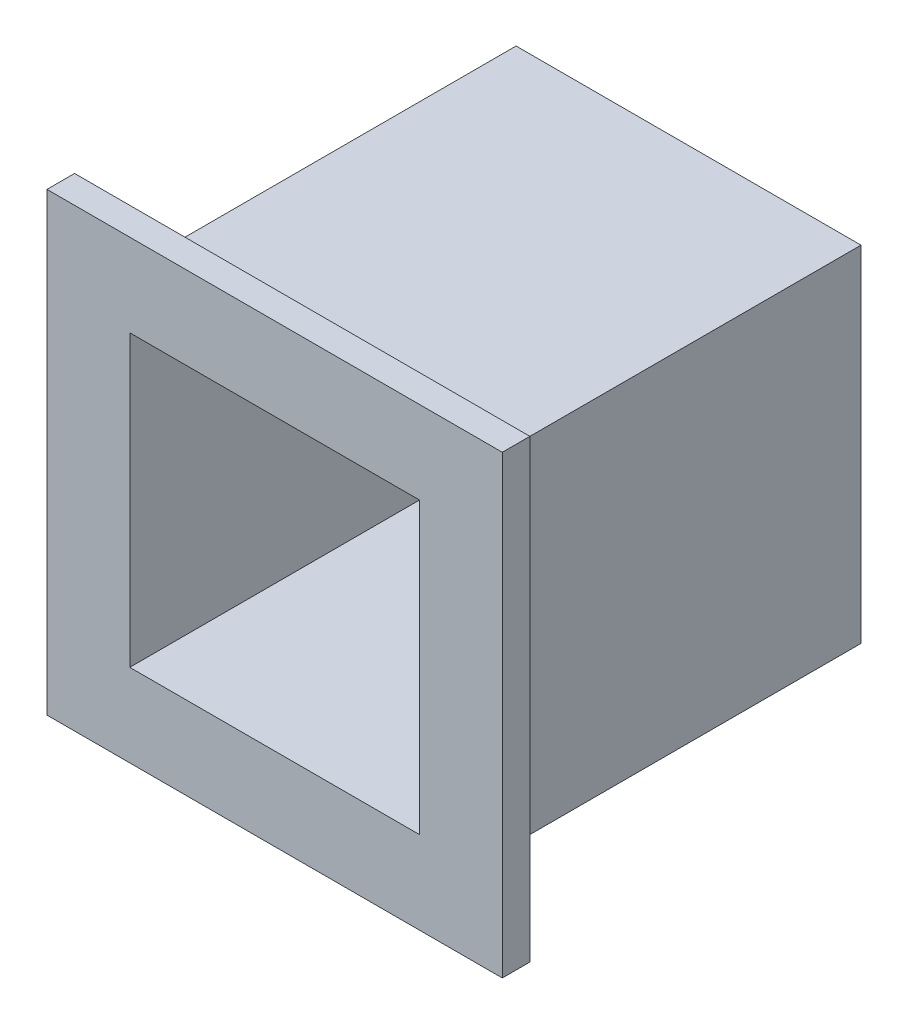
ISO-10303-21;
HEADER;
FILE_DESCRIPTION(('STEP AP214'),'2;1');
FILE_NAME('part.step','',(''),(''),'','','');
FILE_SCHEMA(('AUTOMOTIVE_DESIGN { 1 0 10303 214 1 1 1 1 }'));
ENDSEC;
DATA;
#1=APPLICATION_CONTEXT('core data for automotive mechanical design processes');
#2=APPLICATION_PROTOCOL_DEFINITION('international standard','automotive_design',2000,#1);
#3=PRODUCT_CONTEXT('',#1,'mechanical');
#4=PRODUCT('Part','Part','',(#3));
#5=PRODUCT_RELATED_PRODUCT_CATEGORY('part','',(#4));
#6=PRODUCT_DEFINITION_FORMATION('','',#4);
#7=PRODUCT_DEFINITION_CONTEXT('part definition',#1,'design');
#8=PRODUCT_DEFINITION('design','',#6,#7);
#9=PRODUCT_DEFINITION_SHAPE('','',#8);
#10=(LENGTH_UNIT() NAMED_UNIT(*) SI_UNIT(.MILLI.,.METRE.));
#11=(NAMED_UNIT(*) PLANE_ANGLE_UNIT() SI_UNIT($,.RADIAN.));
#12=(NAMED_UNIT(*) SI_UNIT($,.STERADIAN.) SOLID_ANGLE_UNIT());
#13=UNCERTAINTY_MEASURE_WITH_UNIT(LENGTH_MEASURE(1.E-05),#10,'distance_accuracy_value','');
#14=(GEOMETRIC_REPRESENTATION_CONTEXT(3) GLOBAL_UNCERTAINTY_ASSIGNED_CONTEXT((#13)) GLOBAL_UNIT_ASSIGNED_CONTEXT((#10,
#11,#12)) REPRESENTATION_CONTEXT('',''));
#15=CARTESIAN_POINT('',(0.,0.,0.));
#16=DIRECTION('',(0.,0.,1.));
#17=DIRECTION('',(1.,0.,0.));
#18=AXIS2_PLACEMENT_3D('',#15,#16,#17);
#19=CARTESIAN_POINT('',(0.,0.,15.));
#20=DIRECTION('',(0.,0.,1.));
#21=DIRECTION('',(1.,0.,0.));
#22=AXIS2_PLACEMENT_3D('',#19,#20,#21);
#23=PLANE('',#22);
#24=DIRECTION('',(0.,-1.,0.));
#25=VECTOR('',#24,1.);
#26=CARTESIAN_POINT('',(-5.25,-6.25,15.));
#27=LINE('',#26,#25);
#28=CARTESIAN_POINT('',(-5.25,5.25,15.));
#29=VERTEX_POINT('',#28);
#30=CARTESIAN_POINT('',(-5.25,-5.25,15.));
#31=VERTEX_POINT('',#30);
#32=EDGE_CURVE('E203',#29,#31,#27,.T.);
#33=ORIENTED_EDGE('',*,*,#32,.F.);
#34=DIRECTION('',(-1.,0.,0.));
#35=VECTOR('',#34,1.);
#36=CARTESIAN_POINT('',(6.25,5.25,15.));
#37=LINE('',#36,#35);
#38=CARTESIAN_POINT('',(5.25,5.25,15.));
#39=VERTEX_POINT('',#38);
#40=EDGE_CURVE('E193',#39,#29,#37,.T.);
#41=ORIENTED_EDGE('',*,*,#40,.F.);
#42=DIRECTION('',(0.,1.,0.));
#43=VECTOR('',#42,1.);
#44=CARTESIAN_POINT('',(5.25,-6.25,15.));
#45=LINE('',#44,#43);
#46=CARTESIAN_POINT('',(5.25,-5.25,15.));
#47=VERTEX_POINT('',#46);
#48=EDGE_CURVE('E207',#47,#39,#45,.T.);
#49=ORIENTED_EDGE('',*,*,#48,.F.);
#50=DIRECTION('',(1.,0.,0.));
#51=VECTOR('',#50,1.);
#52=CARTESIAN_POINT('',(6.25,-5.25,15.));
#53=LINE('',#52,#51);
#54=EDGE_CURVE('E205',#31,#47,#53,.T.);
#55=ORIENTED_EDGE('',*,*,#54,.F.);
#56=EDGE_LOOP('',(#33,#41,#49,#55));
#57=FACE_BOUND('',#56,.T.);
#58=DIRECTION('',(0.,1.,0.));
#59=VECTOR('',#58,1.);
#60=CARTESIAN_POINT('',(8.25,-8.25,15.));
#61=LINE('',#60,#59);
#62=CARTESIAN_POINT('',(8.25,-8.25,15.));
#63=VERTEX_POINT('',#62);
#64=CARTESIAN_POINT('',(8.25,8.25,15.));
#65=VERTEX_POINT('',#64);
#66=EDGE_CURVE('E148',#63,#65,#61,.T.);
#67=ORIENTED_EDGE('',*,*,#66,.T.);
#68=DIRECTION('',(-1.,0.,0.));
#69=VECTOR('',#68,1.);
#70=CARTESIAN_POINT('',(8.25,8.25,15.));
#71=LINE('',#70,#69);
#72=CARTESIAN_POINT('',(-8.25,8.25,15.));
#73=VERTEX_POINT('',#72);
#74=EDGE_CURVE('E165',#65,#73,#71,.T.);
#75=ORIENTED_EDGE('',*,*,#74,.T.);
#76=DIRECTION('',(0.,-1.,0.));
#77=VECTOR('',#76,1.);
#78=CARTESIAN_POINT('',(-8.25,8.25,15.));
#79=LINE('',#78,#77);
#80=CARTESIAN_POINT('',(-8.25,-8.25,15.));
#81=VERTEX_POINT('',#80);
#82=EDGE_CURVE('E168',#73,#81,#79,.T.);
#83=ORIENTED_EDGE('',*,*,#82,.T.);
#84=DIRECTION('',(1.,0.,0.));
#85=VECTOR('',#84,1.);
#86=CARTESIAN_POINT('',(-8.25,-8.25,15.));
#87=LINE('',#86,#85);
#88=EDGE_CURVE('E153',#81,#63,#87,.T.);
#89=ORIENTED_EDGE('',*,*,#88,.T.);
#90=EDGE_LOOP('',(#67,#75,#83,#89));
#91=FACE_BOUND('',#90,.T.);
#92=ADVANCED_FACE('F38',(#57,#91),#23,.T.);
#93=CARTESIAN_POINT('',(-5.25,-6.25,15.));
#94=DIRECTION('',(1.,0.,0.));
#95=DIRECTION('',(0.,0.,-1.));
#96=AXIS2_PLACEMENT_3D('',#93,#94,#95);
#97=PLANE('',#96);
#98=DIRECTION('',(0.,-1.,0.));
#99=VECTOR('',#98,1.);
#100=CARTESIAN_POINT('',(-5.25,-6.25,1.));
#101=LINE('',#100,#99);
#102=CARTESIAN_POINT('',(-5.25,5.25,1.));
#103=VERTEX_POINT('',#102);
#104=CARTESIAN_POINT('',(-5.25,-5.25,1.));
#105=VERTEX_POINT('',#104);
#106=EDGE_CURVE('E175',#103,#105,#101,.T.);
#107=ORIENTED_EDGE('',*,*,#106,.F.);
#108=DIRECTION('',(0.,0.,-1.));
#109=VECTOR('',#108,1.);
#110=CARTESIAN_POINT('',(-5.25,5.25,15.));
#111=LINE('',#110,#109);
#112=EDGE_CURVE('E189',#29,#103,#111,.T.);
#113=ORIENTED_EDGE('',*,*,#112,.F.);
#114=ORIENTED_EDGE('',*,*,#32,.T.);
#115=DIRECTION('',(0.,0.,-1.));
#116=VECTOR('',#115,1.);
#117=CARTESIAN_POINT('',(-5.25,-5.25,15.));
#118=LINE('',#117,#116);
#119=EDGE_CURVE('E184',#31,#105,#118,.T.);
#120=ORIENTED_EDGE('',*,*,#119,.T.);
#121=EDGE_LOOP('',(#107,#113,#114,#120));
#122=FACE_BOUND('',#121,.T.);
#123=ADVANCED_FACE('F236',(#122),#97,.T.);
#124=CARTESIAN_POINT('',(6.25,-5.25,15.));
#125=DIRECTION('',(0.,1.,0.));
#126=DIRECTION('',(-1.,0.,0.));
#127=AXIS2_PLACEMENT_3D('',#124,#125,#126);
#128=PLANE('',#127);
#129=DIRECTION('',(1.,0.,0.));
#130=VECTOR('',#129,1.);
#131=CARTESIAN_POINT('',(6.25,-5.25,1.));
#132=LINE('',#131,#130);
#133=CARTESIAN_POINT('',(5.25,-5.25,1.));
#134=VERTEX_POINT('',#133);
#135=EDGE_CURVE('E183',#105,#134,#132,.T.);
#136=ORIENTED_EDGE('',*,*,#135,.F.);
#137=ORIENTED_EDGE('',*,*,#119,.F.);
#138=ORIENTED_EDGE('',*,*,#54,.T.);
#139=DIRECTION('',(0.,0.,-1.));
#140=VECTOR('',#139,1.);
#141=CARTESIAN_POINT('',(5.25,-5.25,15.));
#142=LINE('',#141,#140);
#143=EDGE_CURVE('E188',#47,#134,#142,.T.);
#144=ORIENTED_EDGE('',*,*,#143,.T.);
#145=EDGE_LOOP('',(#136,#137,#138,#144));
#146=FACE_BOUND('',#145,.T.);
#147=ADVANCED_FACE('F241',(#146),#128,.T.);
#148=CARTESIAN_POINT('',(5.25,-6.25,15.));
#149=DIRECTION('',(-1.,0.,0.));
#150=DIRECTION('',(0.,0.,1.));
#151=AXIS2_PLACEMENT_3D('',#148,#149,#150);
#152=PLANE('',#151);
#153=DIRECTION('',(0.,1.,0.));
#154=VECTOR('',#153,1.);
#155=CARTESIAN_POINT('',(5.25,-6.25,1.));
#156=LINE('',#155,#154);
#157=CARTESIAN_POINT('',(5.25,5.25,1.));
#158=VERTEX_POINT('',#157);
#159=EDGE_CURVE('E195',#134,#158,#156,.T.);
#160=ORIENTED_EDGE('',*,*,#159,.F.);
#161=ORIENTED_EDGE('',*,*,#143,.F.);
#162=ORIENTED_EDGE('',*,*,#48,.T.);
#163=DIRECTION('',(0.,0.,-1.));
#164=VECTOR('',#163,1.);
#165=CARTESIAN_POINT('',(5.25,5.25,15.));
#166=LINE('',#165,#164);
#167=EDGE_CURVE('E192',#39,#158,#166,.T.);
#168=ORIENTED_EDGE('',*,*,#167,.T.);
#169=EDGE_LOOP('',(#160,#161,#162,#168));
#170=FACE_BOUND('',#169,.T.);
#171=ADVANCED_FACE('F255',(#170),#152,.T.);
#172=CARTESIAN_POINT('',(6.25,5.25,15.));
#173=DIRECTION('',(0.,-1.,0.));
#174=DIRECTION('',(1.,0.,0.));
#175=AXIS2_PLACEMENT_3D('',#172,#173,#174);
#176=PLANE('',#175);
#177=DIRECTION('',(-1.,0.,0.));
#178=VECTOR('',#177,1.);
#179=CARTESIAN_POINT('',(6.25,5.25,1.));
#180=LINE('',#179,#178);
#181=EDGE_CURVE('E199',#158,#103,#180,.T.);
#182=ORIENTED_EDGE('',*,*,#181,.F.);
#183=ORIENTED_EDGE('',*,*,#167,.F.);
#184=ORIENTED_EDGE('',*,*,#40,.T.);
#185=ORIENTED_EDGE('',*,*,#112,.T.);
#186=EDGE_LOOP('',(#182,#183,#184,#185));
#187=FACE_BOUND('',#186,.T.);
#188=ADVANCED_FACE('F251',(#187),#176,.T.);
#189=CARTESIAN_POINT('',(0.,0.,1.));
#190=DIRECTION('',(0.,0.,1.));
#191=DIRECTION('',(1.,0.,0.));
#192=AXIS2_PLACEMENT_3D('',#189,#190,#191);
#193=PLANE('',#192);
#194=ORIENTED_EDGE('',*,*,#106,.T.);
#195=ORIENTED_EDGE('',*,*,#135,.T.);
#196=ORIENTED_EDGE('',*,*,#159,.T.);
#197=ORIENTED_EDGE('',*,*,#181,.T.);
#198=EDGE_LOOP('',(#194,#195,#196,#197));
#199=FACE_BOUND('',#198,.T.);
#200=ADVANCED_FACE('F247',(#199),#193,.T.);
#201=CARTESIAN_POINT('',(8.25,-8.25,14.));
#202=DIRECTION('',(1.,0.,0.));
#203=DIRECTION('',(0.,0.,-1.));
#204=AXIS2_PLACEMENT_3D('',#201,#202,#203);
#205=PLANE('',#204);
#206=ORIENTED_EDGE('',*,*,#66,.F.);
#207=DIRECTION('',(0.,0.,1.));
#208=VECTOR('',#207,1.);
#209=CARTESIAN_POINT('',(8.25,-8.25,14.));
#210=LINE('',#209,#208);
#211=CARTESIAN_POINT('',(8.25,-8.25,14.));
#212=VERTEX_POINT('',#211);
#213=EDGE_CURVE('E173',#212,#63,#210,.T.);
#214=ORIENTED_EDGE('',*,*,#213,.F.);
#215=DIRECTION('',(0.,1.,0.));
#216=VECTOR('',#215,1.);
#217=CARTESIAN_POINT('',(8.25,-8.25,14.));
#218=LINE('',#217,#216);
#219=CARTESIAN_POINT('',(8.25,8.25,14.));
#220=VERTEX_POINT('',#219);
#221=EDGE_CURVE('E149',#212,#220,#218,.T.);
#222=ORIENTED_EDGE('',*,*,#221,.T.);
#223=DIRECTION('',(0.,0.,1.));
#224=VECTOR('',#223,1.);
#225=CARTESIAN_POINT('',(8.25,8.25,14.));
#226=LINE('',#225,#224);
#227=EDGE_CURVE('E162',#220,#65,#226,.T.);
#228=ORIENTED_EDGE('',*,*,#227,.T.);
#229=EDGE_LOOP('',(#206,#214,#222,#228));
#230=FACE_BOUND('',#229,.T.);
#231=ADVANCED_FACE('F250',(#230),#205,.T.);
#232=CARTESIAN_POINT('',(-8.25,-8.25,14.));
#233=DIRECTION('',(0.,-1.,0.));
#234=DIRECTION('',(1.,0.,0.));
#235=AXIS2_PLACEMENT_3D('',#232,#233,#234);
#236=PLANE('',#235);
#237=ORIENTED_EDGE('',*,*,#88,.F.);
#238=DIRECTION('',(0.,0.,1.));
#239=VECTOR('',#238,1.);
#240=CARTESIAN_POINT('',(-8.25,-8.25,14.));
#241=LINE('',#240,#239);
#242=CARTESIAN_POINT('',(-8.25,-8.25,14.));
#243=VERTEX_POINT('',#242);
#244=EDGE_CURVE('E176',#243,#81,#241,.T.);
#245=ORIENTED_EDGE('',*,*,#244,.F.);
#246=DIRECTION('',(1.,0.,0.));
#247=VECTOR('',#246,1.);
#248=CARTESIAN_POINT('',(-8.25,-8.25,14.));
#249=LINE('',#248,#247);
#250=EDGE_CURVE('E159',#243,#212,#249,.T.);
#251=ORIENTED_EDGE('',*,*,#250,.T.);
#252=ORIENTED_EDGE('',*,*,#213,.T.);
#253=EDGE_LOOP('',(#237,#245,#251,#252));
#254=FACE_BOUND('',#253,.T.);
#255=ADVANCED_FACE('F265',(#254),#236,.T.);
#256=CARTESIAN_POINT('',(-8.25,8.25,14.));
#257=DIRECTION('',(-1.,0.,0.));
#258=DIRECTION('',(0.,-1.,0.));
#259=AXIS2_PLACEMENT_3D('',#256,#257,#258);
#260=PLANE('',#259);
#261=ORIENTED_EDGE('',*,*,#82,.F.);
#262=DIRECTION('',(0.,0.,1.));
#263=VECTOR('',#262,1.);
#264=CARTESIAN_POINT('',(-8.25,8.25,14.));
#265=LINE('',#264,#263);
#266=CARTESIAN_POINT('',(-8.25,8.25,14.));
#267=VERTEX_POINT('',#266);
#268=EDGE_CURVE('E178',#267,#73,#265,.T.);
#269=ORIENTED_EDGE('',*,*,#268,.F.);
#270=DIRECTION('',(0.,-1.,0.));
#271=VECTOR('',#270,1.);
#272=CARTESIAN_POINT('',(-8.25,8.25,14.));
#273=LINE('',#272,#271);
#274=EDGE_CURVE('E156',#267,#243,#273,.T.);
#275=ORIENTED_EDGE('',*,*,#274,.T.);
#276=ORIENTED_EDGE('',*,*,#244,.T.);
#277=EDGE_LOOP('',(#261,#269,#275,#276));
#278=FACE_BOUND('',#277,.T.);
#279=ADVANCED_FACE('F269',(#278),#260,.T.);
#280=CARTESIAN_POINT('',(8.25,8.25,14.));
#281=DIRECTION('',(0.,1.,0.));
#282=DIRECTION('',(-1.,0.,0.));
#283=AXIS2_PLACEMENT_3D('',#280,#281,#282);
#284=PLANE('',#283);
#285=ORIENTED_EDGE('',*,*,#74,.F.);
#286=ORIENTED_EDGE('',*,*,#227,.F.);
#287=DIRECTION('',(-1.,0.,0.));
#288=VECTOR('',#287,1.);
#289=CARTESIAN_POINT('',(8.25,8.25,14.));
#290=LINE('',#289,#288);
#291=EDGE_CURVE('E152',#220,#267,#290,.T.);
#292=ORIENTED_EDGE('',*,*,#291,.T.);
#293=ORIENTED_EDGE('',*,*,#268,.T.);
#294=EDGE_LOOP('',(#285,#286,#292,#293));
#295=FACE_BOUND('',#294,.T.);
#296=ADVANCED_FACE('F232',(#295),#284,.T.);
#297=CARTESIAN_POINT('',(0.,0.,14.));
#298=DIRECTION('',(0.,0.,1.));
#299=DIRECTION('',(1.,0.,0.));
#300=AXIS2_PLACEMENT_3D('',#297,#298,#299);
#301=PLANE('',#300);
#302=DIRECTION('',(0.,1.,0.));
#303=VECTOR('',#302,1.);
#304=CARTESIAN_POINT('',(6.25,-6.25,14.));
#305=LINE('',#304,#303);
#306=CARTESIAN_POINT('',(6.25,-6.25,14.));
#307=VERTEX_POINT('',#306);
#308=CARTESIAN_POINT('',(6.25,6.25,14.));
#309=VERTEX_POINT('',#308);
#310=EDGE_CURVE('E60',#307,#309,#305,.T.);
#311=ORIENTED_EDGE('',*,*,#310,.T.);
#312=DIRECTION('',(-1.,0.,0.));
#313=VECTOR('',#312,1.);
#314=CARTESIAN_POINT('',(6.25,6.25,14.));
#315=LINE('',#314,#313);
#316=CARTESIAN_POINT('',(-6.25,6.25,14.));
#317=VERTEX_POINT('',#316);
#318=EDGE_CURVE('E130',#309,#317,#315,.T.);
#319=ORIENTED_EDGE('',*,*,#318,.T.);
#320=DIRECTION('',(0.,-1.,0.));
#321=VECTOR('',#320,1.);
#322=CARTESIAN_POINT('',(-6.25,6.25,14.));
#323=LINE('',#322,#321);
#324=CARTESIAN_POINT('',(-6.25,-6.25,14.));
#325=VERTEX_POINT('',#324);
#326=EDGE_CURVE('E139',#317,#325,#323,.T.);
#327=ORIENTED_EDGE('',*,*,#326,.T.);
#328=DIRECTION('',(1.,0.,0.));
#329=VECTOR('',#328,1.);
#330=CARTESIAN_POINT('',(-6.25,-6.25,14.));
#331=LINE('',#330,#329);
#332=EDGE_CURVE('E52',#325,#307,#331,.T.);
#333=ORIENTED_EDGE('',*,*,#332,.T.);
#334=EDGE_LOOP('',(#311,#319,#327,#333));
#335=FACE_BOUND('',#334,.T.);
#336=ORIENTED_EDGE('',*,*,#221,.F.);
#337=ORIENTED_EDGE('',*,*,#250,.F.);
#338=ORIENTED_EDGE('',*,*,#274,.F.);
#339=ORIENTED_EDGE('',*,*,#291,.F.);
#340=EDGE_LOOP('',(#336,#337,#338,#339));
#341=FACE_BOUND('',#340,.T.);
#342=ADVANCED_FACE('F142',(#335,#341),#301,.F.);
#343=CARTESIAN_POINT('',(0.,0.,0.));
#344=DIRECTION('',(0.,0.,1.));
#345=DIRECTION('',(1.,0.,0.));
#346=AXIS2_PLACEMENT_3D('',#343,#344,#345);
#347=PLANE('',#346);
#348=DIRECTION('',(0.,-1.,0.));
#349=VECTOR('',#348,1.);
#350=CARTESIAN_POINT('',(-6.25,-6.25,0.));
#351=LINE('',#350,#349);
#352=CARTESIAN_POINT('',(-6.25,6.25,0.));
#353=VERTEX_POINT('',#352);
#354=CARTESIAN_POINT('',(-6.25,-6.25,0.));
#355=VERTEX_POINT('',#354);
#356=EDGE_CURVE('E187',#353,#355,#351,.T.);
#357=ORIENTED_EDGE('',*,*,#356,.F.);
#358=DIRECTION('',(-1.,0.,0.));
#359=VECTOR('',#358,1.);
#360=CARTESIAN_POINT('',(6.25,6.25,0.));
#361=LINE('',#360,#359);
#362=CARTESIAN_POINT('',(6.25,6.25,0.));
#363=VERTEX_POINT('',#362);
#364=EDGE_CURVE('E132',#363,#353,#361,.T.);
#365=ORIENTED_EDGE('',*,*,#364,.F.);
#366=DIRECTION('',(0.,1.,0.));
#367=VECTOR('',#366,1.);
#368=CARTESIAN_POINT('',(6.25,-6.25,0.));
#369=LINE('',#368,#367);
#370=CARTESIAN_POINT('',(6.25,-6.25,0.));
#371=VERTEX_POINT('',#370);
#372=EDGE_CURVE('E215',#371,#363,#369,.T.);
#373=ORIENTED_EDGE('',*,*,#372,.F.);
#374=DIRECTION('',(1.,0.,0.));
#375=VECTOR('',#374,1.);
#376=CARTESIAN_POINT('',(6.25,-6.25,0.));
#377=LINE('',#376,#375);
#378=EDGE_CURVE('E212',#355,#371,#377,.T.);
#379=ORIENTED_EDGE('',*,*,#378,.F.);
#380=EDGE_LOOP('',(#357,#365,#373,#379));
#381=FACE_BOUND('',#380,.T.);
#382=ADVANCED_FACE('F224',(#381),#347,.F.);
#383=CARTESIAN_POINT('',(6.25,6.25,15.));
#384=DIRECTION('',(0.,-1.,0.));
#385=DIRECTION('',(1.,0.,0.));
#386=AXIS2_PLACEMENT_3D('',#383,#384,#385);
#387=PLANE('',#386);
#388=ORIENTED_EDGE('',*,*,#318,.F.);
#389=DIRECTION('',(0.,0.,-1.));
#390=VECTOR('',#389,1.);
#391=CARTESIAN_POINT('',(6.25,6.25,15.));
#392=LINE('',#391,#390);
#393=EDGE_CURVE('E136',#309,#363,#392,.T.);
#394=ORIENTED_EDGE('',*,*,#393,.T.);
#395=ORIENTED_EDGE('',*,*,#364,.T.);
#396=DIRECTION('',(0.,0.,-1.));
#397=VECTOR('',#396,1.);
#398=CARTESIAN_POINT('',(-6.25,6.25,15.));
#399=LINE('',#398,#397);
#400=EDGE_CURVE('E126',#317,#353,#399,.T.);
#401=ORIENTED_EDGE('',*,*,#400,.F.);
#402=EDGE_LOOP('',(#388,#394,#395,#401));
#403=FACE_BOUND('',#402,.T.);
#404=ADVANCED_FACE('F128',(#403),#387,.F.);
#405=CARTESIAN_POINT('',(6.25,-6.25,15.));
#406=DIRECTION('',(-1.,0.,0.));
#407=DIRECTION('',(0.,0.,1.));
#408=AXIS2_PLACEMENT_3D('',#405,#406,#407);
#409=PLANE('',#408);
#410=ORIENTED_EDGE('',*,*,#310,.F.);
#411=DIRECTION('',(0.,0.,-1.));
#412=VECTOR('',#411,1.);
#413=CARTESIAN_POINT('',(6.25,-6.25,15.));
#414=LINE('',#413,#412);
#415=EDGE_CURVE('E46',#307,#371,#414,.T.);
#416=ORIENTED_EDGE('',*,*,#415,.T.);
#417=ORIENTED_EDGE('',*,*,#372,.T.);
#418=ORIENTED_EDGE('',*,*,#393,.F.);
#419=EDGE_LOOP('',(#410,#416,#417,#418));
#420=FACE_BOUND('',#419,.T.);
#421=ADVANCED_FACE('F219',(#420),#409,.F.);
#422=CARTESIAN_POINT('',(6.25,-6.25,15.));
#423=DIRECTION('',(0.,1.,0.));
#424=DIRECTION('',(-1.,0.,0.));
#425=AXIS2_PLACEMENT_3D('',#422,#423,#424);
#426=PLANE('',#425);
#427=ORIENTED_EDGE('',*,*,#332,.F.);
#428=DIRECTION('',(0.,0.,-1.));
#429=VECTOR('',#428,1.);
#430=CARTESIAN_POINT('',(-6.25,-6.25,15.));
#431=LINE('',#430,#429);
#432=EDGE_CURVE('E11',#325,#355,#431,.T.);
#433=ORIENTED_EDGE('',*,*,#432,.T.);
#434=ORIENTED_EDGE('',*,*,#378,.T.);
#435=ORIENTED_EDGE('',*,*,#415,.F.);
#436=EDGE_LOOP('',(#427,#433,#434,#435));
#437=FACE_BOUND('',#436,.T.);
#438=ADVANCED_FACE('F222',(#437),#426,.F.);
#439=CARTESIAN_POINT('',(-6.25,-6.25,15.));
#440=DIRECTION('',(1.,0.,0.));
#441=DIRECTION('',(0.,0.,-1.));
#442=AXIS2_PLACEMENT_3D('',#439,#440,#441);
#443=PLANE('',#442);
#444=ORIENTED_EDGE('',*,*,#326,.F.);
#445=ORIENTED_EDGE('',*,*,#400,.T.);
#446=ORIENTED_EDGE('',*,*,#356,.T.);
#447=ORIENTED_EDGE('',*,*,#432,.F.);
#448=EDGE_LOOP('',(#444,#445,#446,#447));
#449=FACE_BOUND('',#448,.T.);
#450=ADVANCED_FACE('F40',(#449),#443,.F.);
#451=CLOSED_SHELL('',(#92,#123,#147,#171,#188,#200,#231,#255,#279,#296,#342,#382,#404,#421,#438,#450));
#452=MANIFOLD_SOLID_BREP('B2',#451);
#453=ADVANCED_BREP_SHAPE_REPRESENTATION('',(#18,#452),#14);
#454=SHAPE_DEFINITION_REPRESENTATION(#9,#453);
ENDSEC;
END-ISO-10303-21;
